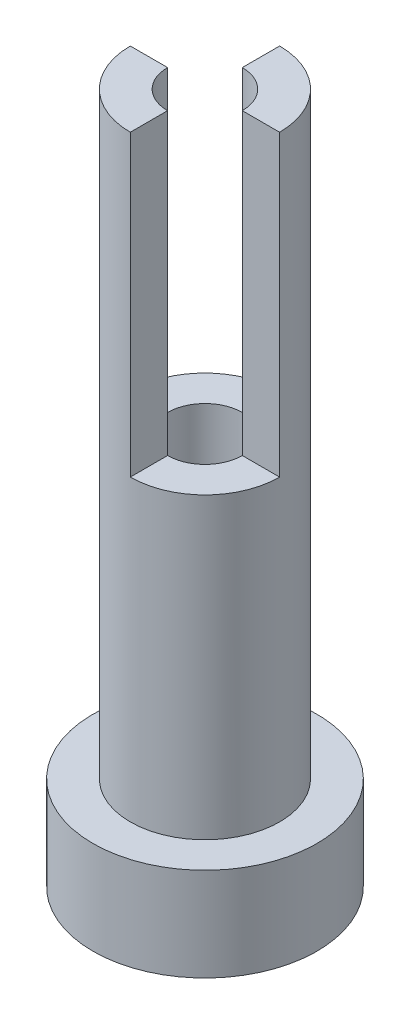
ISO-10303-21;
HEADER;
FILE_DESCRIPTION(('STEP AP214'),'2;1');
FILE_NAME('part.step','',(''),(''),'','','');
FILE_SCHEMA(('AUTOMOTIVE_DESIGN { 1 0 10303 214 1 1 1 1 }'));
ENDSEC;
DATA;
#1=APPLICATION_CONTEXT('core data for automotive mechanical design processes');
#2=APPLICATION_PROTOCOL_DEFINITION('international standard','automotive_design',2000,#1);
#3=PRODUCT_CONTEXT('',#1,'mechanical');
#4=PRODUCT('Part','Part','',(#3));
#5=PRODUCT_RELATED_PRODUCT_CATEGORY('part','',(#4));
#6=PRODUCT_DEFINITION_FORMATION('','',#4);
#7=PRODUCT_DEFINITION_CONTEXT('part definition',#1,'design');
#8=PRODUCT_DEFINITION('design','',#6,#7);
#9=PRODUCT_DEFINITION_SHAPE('','',#8);
#10=(LENGTH_UNIT() NAMED_UNIT(*) SI_UNIT(.MILLI.,.METRE.));
#11=(NAMED_UNIT(*) PLANE_ANGLE_UNIT() SI_UNIT($,.RADIAN.));
#12=(NAMED_UNIT(*) SI_UNIT($,.STERADIAN.) SOLID_ANGLE_UNIT());
#13=UNCERTAINTY_MEASURE_WITH_UNIT(LENGTH_MEASURE(1.E-05),#10,'distance_accuracy_value','');
#14=(GEOMETRIC_REPRESENTATION_CONTEXT(3) GLOBAL_UNCERTAINTY_ASSIGNED_CONTEXT((#13)) GLOBAL_UNIT_ASSIGNED_CONTEXT((#10,
#11,#12)) REPRESENTATION_CONTEXT('',''));
#15=CARTESIAN_POINT('',(0.,0.,0.));
#16=DIRECTION('',(0.,0.,1.));
#17=DIRECTION('',(1.,0.,0.));
#18=AXIS2_PLACEMENT_3D('',#15,#16,#17);
#19=CARTESIAN_POINT('',(0.,29.,0.));
#20=DIRECTION('',(0.,-1.,0.));
#21=DIRECTION('',(0.,0.,-1.));
#22=AXIS2_PLACEMENT_3D('',#19,#20,#21);
#23=CYLINDRICAL_SURFACE('',#22,2.);
#24=CARTESIAN_POINT('',(0.,2.5,0.));
#25=DIRECTION('',(0.,1.,0.));
#26=DIRECTION('',(0.,0.,1.));
#27=AXIS2_PLACEMENT_3D('',#24,#25,#26);
#28=CIRCLE('',#27,2.);
#29=CARTESIAN_POINT('',(0.,2.5,2.));
#30=VERTEX_POINT('',#29);
#31=EDGE_CURVE('E165',#30,#30,#28,.T.);
#32=ORIENTED_EDGE('',*,*,#31,.T.);
#33=EDGE_LOOP('',(#32));
#34=FACE_BOUND('',#33,.T.);
#35=DIRECTION('',(0.,1.,0.));
#36=VECTOR('',#35,1.);
#37=CARTESIAN_POINT('',(2.,10.5,0.));
#38=LINE('',#37,#36);
#39=CARTESIAN_POINT('',(2.,10.5,0.));
#40=VERTEX_POINT('',#39);
#41=CARTESIAN_POINT('',(2.,18.5,0.));
#42=VERTEX_POINT('',#41);
#43=EDGE_CURVE('E108',#40,#42,#38,.T.);
#44=ORIENTED_EDGE('',*,*,#43,.F.);
#45=CARTESIAN_POINT('',(0.,10.5,0.));
#46=DIRECTION('',(0.,1.,0.));
#47=DIRECTION('',(0.,0.,1.));
#48=AXIS2_PLACEMENT_3D('',#45,#46,#47);
#49=CIRCLE('',#48,2.);
#50=CARTESIAN_POINT('',(0.,10.5,2.));
#51=VERTEX_POINT('',#50);
#52=EDGE_CURVE('E113',#51,#40,#49,.T.);
#53=ORIENTED_EDGE('',*,*,#52,.F.);
#54=DIRECTION('',(0.,1.,0.));
#55=VECTOR('',#54,1.);
#56=CARTESIAN_POINT('',(0.,10.5,2.));
#57=LINE('',#56,#55);
#58=CARTESIAN_POINT('',(0.,18.5,2.));
#59=VERTEX_POINT('',#58);
#60=EDGE_CURVE('E125',#51,#59,#57,.T.);
#61=ORIENTED_EDGE('',*,*,#60,.T.);
#62=CARTESIAN_POINT('',(0.,18.5,0.));
#63=DIRECTION('',(0.,1.,0.));
#64=DIRECTION('',(0.,0.,1.));
#65=AXIS2_PLACEMENT_3D('',#62,#63,#64);
#66=CIRCLE('',#65,2.);
#67=CARTESIAN_POINT('',(-2.,18.5,0.));
#68=VERTEX_POINT('',#67);
#69=EDGE_CURVE('E155',#68,#59,#66,.T.);
#70=ORIENTED_EDGE('',*,*,#69,.F.);
#71=DIRECTION('',(0.,1.,0.));
#72=VECTOR('',#71,1.);
#73=CARTESIAN_POINT('',(-2.,10.5,0.));
#74=LINE('',#73,#72);
#75=CARTESIAN_POINT('',(-2.,10.5,0.));
#76=VERTEX_POINT('',#75);
#77=EDGE_CURVE('E62',#76,#68,#74,.T.);
#78=ORIENTED_EDGE('',*,*,#77,.F.);
#79=CARTESIAN_POINT('',(0.,10.5,0.));
#80=DIRECTION('',(0.,1.,0.));
#81=DIRECTION('',(0.,0.,1.));
#82=AXIS2_PLACEMENT_3D('',#79,#80,#81);
#83=CIRCLE('',#82,2.);
#84=CARTESIAN_POINT('',(0.,10.5,-2.));
#85=VERTEX_POINT('',#84);
#86=EDGE_CURVE('E140',#85,#76,#83,.T.);
#87=ORIENTED_EDGE('',*,*,#86,.F.);
#88=DIRECTION('',(0.,1.,0.));
#89=VECTOR('',#88,1.);
#90=CARTESIAN_POINT('',(0.,10.5,-2.));
#91=LINE('',#90,#89);
#92=CARTESIAN_POINT('',(0.,18.5,-2.));
#93=VERTEX_POINT('',#92);
#94=EDGE_CURVE('E143',#85,#93,#91,.T.);
#95=ORIENTED_EDGE('',*,*,#94,.T.);
#96=EDGE_CURVE('E124',#42,#93,#66,.T.);
#97=ORIENTED_EDGE('',*,*,#96,.F.);
#98=EDGE_LOOP('',(#44,#53,#61,#70,#78,#87,#95,#97));
#99=FACE_BOUND('',#98,.T.);
#100=ADVANCED_FACE('F40',(#34,#99),#23,.T.);
#101=CARTESIAN_POINT('',(0.,29.,0.));
#102=DIRECTION('',(0.,-1.,0.));
#103=DIRECTION('',(0.,0.,-1.));
#104=AXIS2_PLACEMENT_3D('',#101,#102,#103);
#105=CYLINDRICAL_SURFACE('',#104,1.);
#106=CARTESIAN_POINT('',(0.,1.5,0.));
#107=DIRECTION('',(0.,1.,0.));
#108=DIRECTION('',(0.,0.,1.));
#109=AXIS2_PLACEMENT_3D('',#106,#107,#108);
#110=CIRCLE('',#109,1.);
#111=CARTESIAN_POINT('',(0.,1.5,1.));
#112=VERTEX_POINT('',#111);
#113=EDGE_CURVE('E162',#112,#112,#110,.T.);
#114=ORIENTED_EDGE('',*,*,#113,.F.);
#115=EDGE_LOOP('',(#114));
#116=FACE_BOUND('',#115,.T.);
#117=CARTESIAN_POINT('',(0.,10.5,0.));
#118=DIRECTION('',(0.,1.,0.));
#119=DIRECTION('',(0.,0.,1.));
#120=AXIS2_PLACEMENT_3D('',#117,#118,#119);
#121=CIRCLE('',#120,1.);
#122=CARTESIAN_POINT('',(0.,10.5,1.));
#123=VERTEX_POINT('',#122);
#124=CARTESIAN_POINT('',(1.,10.5,0.));
#125=VERTEX_POINT('',#124);
#126=EDGE_CURVE('E11',#123,#125,#121,.T.);
#127=ORIENTED_EDGE('',*,*,#126,.T.);
#128=DIRECTION('',(0.,-1.,0.));
#129=VECTOR('',#128,1.);
#130=CARTESIAN_POINT('',(1.,29.,0.));
#131=LINE('',#130,#129);
#132=CARTESIAN_POINT('',(1.,18.5,0.));
#133=VERTEX_POINT('',#132);
#134=EDGE_CURVE('E111',#125,#133,#131,.F.);
#135=ORIENTED_EDGE('',*,*,#134,.T.);
#136=CARTESIAN_POINT('',(0.,18.5,0.));
#137=DIRECTION('',(0.,1.,0.));
#138=DIRECTION('',(0.,0.,1.));
#139=AXIS2_PLACEMENT_3D('',#136,#137,#138);
#140=CIRCLE('',#139,1.);
#141=CARTESIAN_POINT('',(0.,18.5,-1.));
#142=VERTEX_POINT('',#141);
#143=EDGE_CURVE('E154',#133,#142,#140,.T.);
#144=ORIENTED_EDGE('',*,*,#143,.T.);
#145=DIRECTION('',(0.,-1.,0.));
#146=VECTOR('',#145,1.);
#147=CARTESIAN_POINT('',(0.,29.,-1.));
#148=LINE('',#147,#146);
#149=CARTESIAN_POINT('',(0.,10.5,-1.));
#150=VERTEX_POINT('',#149);
#151=EDGE_CURVE('E151',#142,#150,#148,.T.);
#152=ORIENTED_EDGE('',*,*,#151,.T.);
#153=CARTESIAN_POINT('',(0.,10.5,0.));
#154=DIRECTION('',(0.,1.,0.));
#155=DIRECTION('',(0.,0.,1.));
#156=AXIS2_PLACEMENT_3D('',#153,#154,#155);
#157=CIRCLE('',#156,1.);
#158=CARTESIAN_POINT('',(-1.,10.5,0.));
#159=VERTEX_POINT('',#158);
#160=EDGE_CURVE('E172',#150,#159,#157,.T.);
#161=ORIENTED_EDGE('',*,*,#160,.T.);
#162=DIRECTION('',(0.,-1.,0.));
#163=VECTOR('',#162,1.);
#164=CARTESIAN_POINT('',(-1.,29.,0.));
#165=LINE('',#164,#163);
#166=CARTESIAN_POINT('',(-1.,18.5,0.));
#167=VERTEX_POINT('',#166);
#168=EDGE_CURVE('E149',#167,#159,#165,.T.);
#169=ORIENTED_EDGE('',*,*,#168,.F.);
#170=CARTESIAN_POINT('',(0.,18.5,1.));
#171=VERTEX_POINT('',#170);
#172=EDGE_CURVE('E177',#167,#171,#140,.T.);
#173=ORIENTED_EDGE('',*,*,#172,.T.);
#174=DIRECTION('',(0.,-1.,0.));
#175=VECTOR('',#174,1.);
#176=CARTESIAN_POINT('',(0.,29.,1.));
#177=LINE('',#176,#175);
#178=EDGE_CURVE('E54',#123,#171,#177,.F.);
#179=ORIENTED_EDGE('',*,*,#178,.F.);
#180=EDGE_LOOP('',(#127,#135,#144,#152,#161,#169,#173,#179));
#181=FACE_BOUND('',#180,.T.);
#182=ADVANCED_FACE('F188',(#116,#181),#105,.F.);
#183=CARTESIAN_POINT('',(0.,18.5,0.));
#184=DIRECTION('',(0.,1.,0.));
#185=DIRECTION('',(0.,0.,1.));
#186=AXIS2_PLACEMENT_3D('',#183,#184,#185);
#187=PLANE('',#186);
#188=ORIENTED_EDGE('',*,*,#143,.F.);
#189=DIRECTION('',(1.,0.,0.));
#190=VECTOR('',#189,1.);
#191=CARTESIAN_POINT('',(0.,18.5,0.));
#192=LINE('',#191,#190);
#193=EDGE_CURVE('E47',#133,#42,#192,.T.);
#194=ORIENTED_EDGE('',*,*,#193,.T.);
#195=ORIENTED_EDGE('',*,*,#96,.T.);
#196=DIRECTION('',(0.,0.,1.));
#197=VECTOR('',#196,1.);
#198=CARTESIAN_POINT('',(0.,18.5,0.));
#199=LINE('',#198,#197);
#200=EDGE_CURVE('E132',#93,#142,#199,.T.);
#201=ORIENTED_EDGE('',*,*,#200,.T.);
#202=EDGE_LOOP('',(#188,#194,#195,#201));
#203=FACE_BOUND('',#202,.T.);
#204=ADVANCED_FACE('F185',(#203),#187,.T.);
#205=DIRECTION('',(0.,0.,1.));
#206=VECTOR('',#205,1.);
#207=CARTESIAN_POINT('',(0.,18.5,0.));
#208=LINE('',#207,#206);
#209=EDGE_CURVE('E182',#171,#59,#208,.T.);
#210=ORIENTED_EDGE('',*,*,#209,.F.);
#211=ORIENTED_EDGE('',*,*,#172,.F.);
#212=DIRECTION('',(1.,0.,0.));
#213=VECTOR('',#212,1.);
#214=CARTESIAN_POINT('',(0.,18.5,0.));
#215=LINE('',#214,#213);
#216=EDGE_CURVE('E137',#68,#167,#215,.T.);
#217=ORIENTED_EDGE('',*,*,#216,.F.);
#218=ORIENTED_EDGE('',*,*,#69,.T.);
#219=EDGE_LOOP('',(#210,#211,#217,#218));
#220=FACE_BOUND('',#219,.T.);
#221=ADVANCED_FACE('F193',(#220),#187,.T.);
#222=CARTESIAN_POINT('',(0.,0.,0.));
#223=DIRECTION('',(0.,1.,0.));
#224=DIRECTION('',(0.,0.,1.));
#225=AXIS2_PLACEMENT_3D('',#222,#223,#224);
#226=PLANE('',#225);
#227=CARTESIAN_POINT('',(0.,0.,0.));
#228=DIRECTION('',(0.,1.,0.));
#229=DIRECTION('',(0.,0.,1.));
#230=AXIS2_PLACEMENT_3D('',#227,#228,#229);
#231=CIRCLE('',#230,1.6);
#232=CARTESIAN_POINT('',(0.,0.,1.6));
#233=VERTEX_POINT('',#232);
#234=EDGE_CURVE('E158',#233,#233,#231,.T.);
#235=ORIENTED_EDGE('',*,*,#234,.T.);
#236=EDGE_LOOP('',(#235));
#237=FACE_BOUND('',#236,.T.);
#238=CARTESIAN_POINT('',(0.,0.,0.));
#239=DIRECTION('',(0.,1.,0.));
#240=DIRECTION('',(0.,0.,1.));
#241=AXIS2_PLACEMENT_3D('',#238,#239,#240);
#242=CIRCLE('',#241,3.);
#243=CARTESIAN_POINT('',(0.,0.,3.));
#244=VERTEX_POINT('',#243);
#245=EDGE_CURVE('E168',#244,#244,#242,.T.);
#246=ORIENTED_EDGE('',*,*,#245,.F.);
#247=EDGE_LOOP('',(#246));
#248=FACE_BOUND('',#247,.T.);
#249=ADVANCED_FACE('F227',(#237,#248),#226,.F.);
#250=CARTESIAN_POINT('',(0.,2.5,0.));
#251=DIRECTION('',(0.,1.,0.));
#252=DIRECTION('',(0.,0.,1.));
#253=AXIS2_PLACEMENT_3D('',#250,#251,#252);
#254=PLANE('',#253);
#255=CARTESIAN_POINT('',(0.,2.5,0.));
#256=DIRECTION('',(0.,1.,0.));
#257=DIRECTION('',(0.,0.,1.));
#258=AXIS2_PLACEMENT_3D('',#255,#256,#257);
#259=CIRCLE('',#258,3.);
#260=CARTESIAN_POINT('',(0.,2.5,3.));
#261=VERTEX_POINT('',#260);
#262=EDGE_CURVE('E169',#261,#261,#259,.T.);
#263=ORIENTED_EDGE('',*,*,#262,.T.);
#264=EDGE_LOOP('',(#263));
#265=FACE_BOUND('',#264,.T.);
#266=ORIENTED_EDGE('',*,*,#31,.F.);
#267=EDGE_LOOP('',(#266));
#268=FACE_BOUND('',#267,.T.);
#269=ADVANCED_FACE('F224',(#265,#268),#254,.T.);
#270=CARTESIAN_POINT('',(0.,2.5,0.));
#271=DIRECTION('',(0.,-1.,0.));
#272=DIRECTION('',(0.,0.,-1.));
#273=AXIS2_PLACEMENT_3D('',#270,#271,#272);
#274=CYLINDRICAL_SURFACE('',#273,3.);
#275=ORIENTED_EDGE('',*,*,#262,.F.);
#276=EDGE_LOOP('',(#275));
#277=FACE_BOUND('',#276,.T.);
#278=ORIENTED_EDGE('',*,*,#245,.T.);
#279=EDGE_LOOP('',(#278));
#280=FACE_BOUND('',#279,.T.);
#281=ADVANCED_FACE('F226',(#277,#280),#274,.T.);
#282=CARTESIAN_POINT('',(0.,1.5,0.));
#283=DIRECTION('',(0.,-1.,0.));
#284=DIRECTION('',(0.,0.,-1.));
#285=AXIS2_PLACEMENT_3D('',#282,#283,#284);
#286=CYLINDRICAL_SURFACE('',#285,1.6);
#287=CARTESIAN_POINT('',(0.,1.5,0.));
#288=DIRECTION('',(0.,1.,0.));
#289=DIRECTION('',(0.,0.,1.));
#290=AXIS2_PLACEMENT_3D('',#287,#288,#289);
#291=CIRCLE('',#290,1.6);
#292=CARTESIAN_POINT('',(0.,1.5,1.6));
#293=VERTEX_POINT('',#292);
#294=EDGE_CURVE('E159',#293,#293,#291,.T.);
#295=ORIENTED_EDGE('',*,*,#294,.T.);
#296=EDGE_LOOP('',(#295));
#297=FACE_BOUND('',#296,.T.);
#298=ORIENTED_EDGE('',*,*,#234,.F.);
#299=EDGE_LOOP('',(#298));
#300=FACE_BOUND('',#299,.T.);
#301=ADVANCED_FACE('F211',(#297,#300),#286,.F.);
#302=CARTESIAN_POINT('',(0.,1.5,0.));
#303=DIRECTION('',(0.,1.,0.));
#304=DIRECTION('',(0.,0.,1.));
#305=AXIS2_PLACEMENT_3D('',#302,#303,#304);
#306=PLANE('',#305);
#307=ORIENTED_EDGE('',*,*,#113,.T.);
#308=EDGE_LOOP('',(#307));
#309=FACE_BOUND('',#308,.T.);
#310=ORIENTED_EDGE('',*,*,#294,.F.);
#311=EDGE_LOOP('',(#310));
#312=FACE_BOUND('',#311,.T.);
#313=ADVANCED_FACE('F204',(#309,#312),#306,.F.);
#314=CARTESIAN_POINT('',(0.,10.5,0.));
#315=DIRECTION('',(-1.,0.,0.));
#316=DIRECTION('',(0.,0.,1.));
#317=AXIS2_PLACEMENT_3D('',#314,#315,#316);
#318=PLANE('',#317);
#319=ORIENTED_EDGE('',*,*,#200,.F.);
#320=ORIENTED_EDGE('',*,*,#94,.F.);
#321=DIRECTION('',(0.,0.,1.));
#322=VECTOR('',#321,1.);
#323=CARTESIAN_POINT('',(0.,10.5,0.));
#324=LINE('',#323,#322);
#325=EDGE_CURVE('E133',#85,#150,#324,.T.);
#326=ORIENTED_EDGE('',*,*,#325,.T.);
#327=ORIENTED_EDGE('',*,*,#151,.F.);
#328=EDGE_LOOP('',(#319,#320,#326,#327));
#329=FACE_BOUND('',#328,.T.);
#330=ADVANCED_FACE('F202',(#329),#318,.T.);
#331=CARTESIAN_POINT('',(0.,10.5,0.));
#332=DIRECTION('',(0.,0.,1.));
#333=DIRECTION('',(1.,0.,0.));
#334=AXIS2_PLACEMENT_3D('',#331,#332,#333);
#335=PLANE('',#334);
#336=ORIENTED_EDGE('',*,*,#168,.T.);
#337=DIRECTION('',(1.,0.,0.));
#338=VECTOR('',#337,1.);
#339=CARTESIAN_POINT('',(0.,10.5,0.));
#340=LINE('',#339,#338);
#341=EDGE_CURVE('E136',#76,#159,#340,.T.);
#342=ORIENTED_EDGE('',*,*,#341,.F.);
#343=ORIENTED_EDGE('',*,*,#77,.T.);
#344=ORIENTED_EDGE('',*,*,#216,.T.);
#345=EDGE_LOOP('',(#336,#342,#343,#344));
#346=FACE_BOUND('',#345,.T.);
#347=ADVANCED_FACE('F196',(#346),#335,.F.);
#348=CARTESIAN_POINT('',(0.,10.5,0.));
#349=DIRECTION('',(0.,1.,0.));
#350=DIRECTION('',(0.,0.,1.));
#351=AXIS2_PLACEMENT_3D('',#348,#349,#350);
#352=PLANE('',#351);
#353=ORIENTED_EDGE('',*,*,#325,.F.);
#354=ORIENTED_EDGE('',*,*,#86,.T.);
#355=ORIENTED_EDGE('',*,*,#341,.T.);
#356=ORIENTED_EDGE('',*,*,#160,.F.);
#357=EDGE_LOOP('',(#353,#354,#355,#356));
#358=FACE_BOUND('',#357,.T.);
#359=ADVANCED_FACE('F199',(#358),#352,.T.);
#360=CARTESIAN_POINT('',(0.,10.5,0.));
#361=DIRECTION('',(0.,0.,1.));
#362=DIRECTION('',(1.,0.,0.));
#363=AXIS2_PLACEMENT_3D('',#360,#361,#362);
#364=PLANE('',#363);
#365=DIRECTION('',(1.,0.,0.));
#366=VECTOR('',#365,1.);
#367=CARTESIAN_POINT('',(0.,10.5,0.));
#368=LINE('',#367,#366);
#369=EDGE_CURVE('E104',#125,#40,#368,.T.);
#370=ORIENTED_EDGE('',*,*,#369,.T.);
#371=ORIENTED_EDGE('',*,*,#43,.T.);
#372=ORIENTED_EDGE('',*,*,#193,.F.);
#373=ORIENTED_EDGE('',*,*,#134,.F.);
#374=EDGE_LOOP('',(#370,#371,#372,#373));
#375=FACE_BOUND('',#374,.T.);
#376=ADVANCED_FACE('F106',(#375),#364,.T.);
#377=CARTESIAN_POINT('',(0.,10.5,0.));
#378=DIRECTION('',(-1.,0.,0.));
#379=DIRECTION('',(0.,0.,1.));
#380=AXIS2_PLACEMENT_3D('',#377,#378,#379);
#381=PLANE('',#380);
#382=ORIENTED_EDGE('',*,*,#178,.T.);
#383=ORIENTED_EDGE('',*,*,#209,.T.);
#384=ORIENTED_EDGE('',*,*,#60,.F.);
#385=DIRECTION('',(0.,0.,1.));
#386=VECTOR('',#385,1.);
#387=CARTESIAN_POINT('',(0.,10.5,0.));
#388=LINE('',#387,#386);
#389=EDGE_CURVE('E117',#123,#51,#388,.T.);
#390=ORIENTED_EDGE('',*,*,#389,.F.);
#391=EDGE_LOOP('',(#382,#383,#384,#390));
#392=FACE_BOUND('',#391,.T.);
#393=ADVANCED_FACE('F190',(#392),#381,.F.);
#394=CARTESIAN_POINT('',(0.,10.5,0.));
#395=DIRECTION('',(0.,1.,0.));
#396=DIRECTION('',(0.,0.,1.));
#397=AXIS2_PLACEMENT_3D('',#394,#395,#396);
#398=PLANE('',#397);
#399=ORIENTED_EDGE('',*,*,#389,.T.);
#400=ORIENTED_EDGE('',*,*,#52,.T.);
#401=ORIENTED_EDGE('',*,*,#369,.F.);
#402=ORIENTED_EDGE('',*,*,#126,.F.);
#403=EDGE_LOOP('',(#399,#400,#401,#402));
#404=FACE_BOUND('',#403,.T.);
#405=ADVANCED_FACE('F116',(#404),#398,.T.);
#406=CLOSED_SHELL('',(#100,#182,#204,#221,#249,#269,#281,#301,#313,#330,#347,#359,#376,#393,#405));
#407=MANIFOLD_SOLID_BREP('B2',#406);
#408=ADVANCED_BREP_SHAPE_REPRESENTATION('',(#18,#407),#14);
#409=SHAPE_DEFINITION_REPRESENTATION(#9,#408);
ENDSEC;
END-ISO-10303-21;
